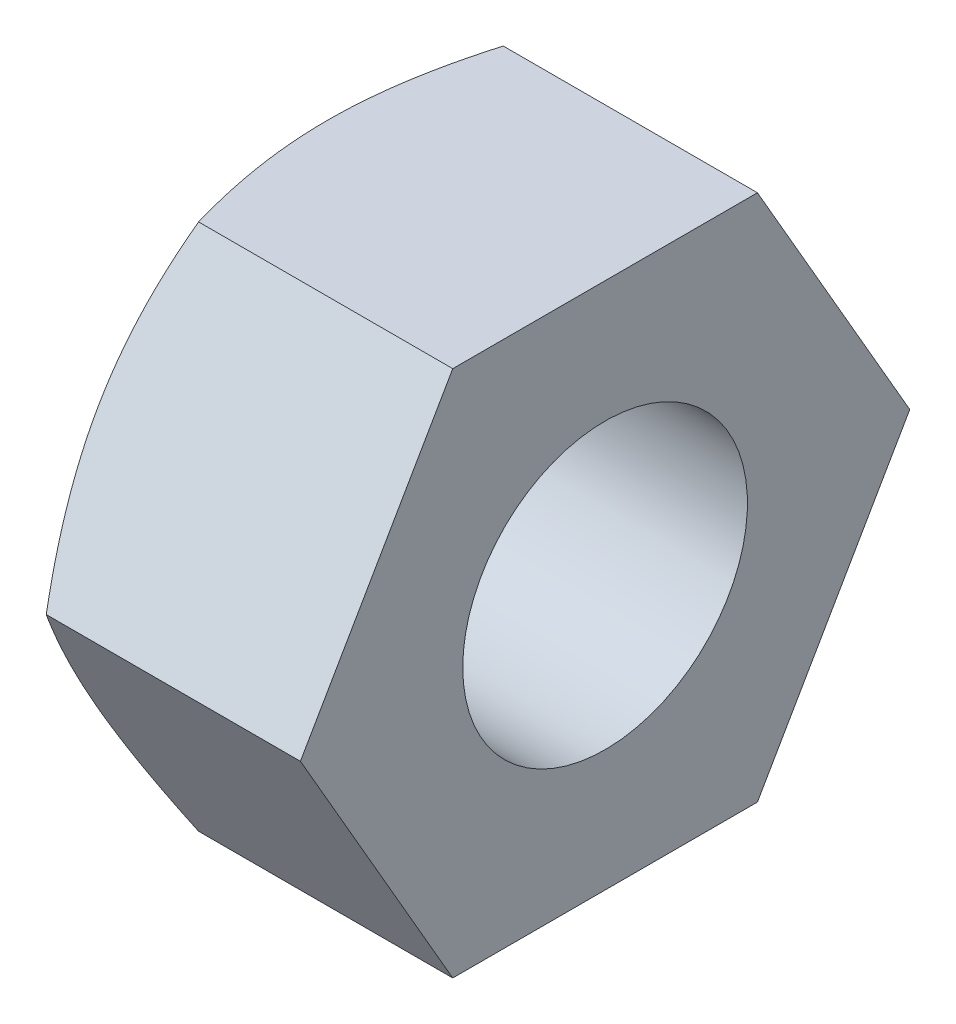
ISO-10303-21;
HEADER;
FILE_DESCRIPTION(('STEP AP214'),'2;1');
FILE_NAME('part.step','',(''),(''),'','','');
FILE_SCHEMA(('AUTOMOTIVE_DESIGN { 1 0 10303 214 1 1 1 1 }'));
ENDSEC;
DATA;
#1=APPLICATION_CONTEXT('core data for automotive mechanical design processes');
#2=APPLICATION_PROTOCOL_DEFINITION('international standard','automotive_design',2000,#1);
#3=PRODUCT_CONTEXT('',#1,'mechanical');
#4=PRODUCT('Part','Part','',(#3));
#5=PRODUCT_RELATED_PRODUCT_CATEGORY('part','',(#4));
#6=PRODUCT_DEFINITION_FORMATION('','',#4);
#7=PRODUCT_DEFINITION_CONTEXT('part definition',#1,'design');
#8=PRODUCT_DEFINITION('design','',#6,#7);
#9=PRODUCT_DEFINITION_SHAPE('','',#8);
#10=(LENGTH_UNIT() NAMED_UNIT(*) SI_UNIT(.MILLI.,.METRE.));
#11=(NAMED_UNIT(*) PLANE_ANGLE_UNIT() SI_UNIT($,.RADIAN.));
#12=(NAMED_UNIT(*) SI_UNIT($,.STERADIAN.) SOLID_ANGLE_UNIT());
#13=UNCERTAINTY_MEASURE_WITH_UNIT(LENGTH_MEASURE(1.E-05),#10,'distance_accuracy_value','');
#14=(GEOMETRIC_REPRESENTATION_CONTEXT(3) GLOBAL_UNCERTAINTY_ASSIGNED_CONTEXT((#13)) GLOBAL_UNIT_ASSIGNED_CONTEXT((#10,
#11,#12)) REPRESENTATION_CONTEXT('',''));
#15=CARTESIAN_POINT('',(0.,0.,0.));
#16=DIRECTION('',(0.,0.,1.));
#17=DIRECTION('',(1.,0.,0.));
#18=AXIS2_PLACEMENT_3D('',#15,#16,#17);
#19=CARTESIAN_POINT('',(484.152262189073,933.585270427388,20.));
#20=DIRECTION('',(-1.,0.,0.));
#21=DIRECTION('',(0.,0.,1.));
#22=AXIS2_PLACEMENT_3D('',#19,#20,#21);
#23=PLANE('',#22);
#24=DIRECTION('',(0.,0.,1.));
#25=VECTOR('',#24,1.);
#26=CARTESIAN_POINT('',(484.152262189073,924.085270427388,14.5151731));
#27=LINE('',#26,#25);
#28=CARTESIAN_POINT('',(484.152262189073,924.085270427388,14.5151731));
#29=VERTEX_POINT('',#28);
#30=CARTESIAN_POINT('',(484.152262189073,924.085270427388,25.4848269));
#31=VERTEX_POINT('',#30);
#32=EDGE_CURVE('E211',#29,#31,#27,.T.);
#33=ORIENTED_EDGE('',*,*,#32,.F.);
#34=DIRECTION('',(0.,-0.866025392230548,0.500000020011925));
#35=VECTOR('',#34,1.);
#36=CARTESIAN_POINT('',(484.152262189073,933.585270427388,9.03034525));
#37=LINE('',#36,#35);
#38=CARTESIAN_POINT('',(484.152262189073,933.585270427388,9.03034525));
#39=VERTEX_POINT('',#38);
#40=EDGE_CURVE('E203',#39,#29,#37,.T.);
#41=ORIENTED_EDGE('',*,*,#40,.F.);
#42=DIRECTION('',(0.,-0.866025392230549,-0.500000020011923));
#43=VECTOR('',#42,1.);
#44=CARTESIAN_POINT('',(484.152262189073,943.085270427388,14.5151731));
#45=LINE('',#44,#43);
#46=CARTESIAN_POINT('',(484.152262189073,943.085270427388,14.5151731));
#47=VERTEX_POINT('',#46);
#48=EDGE_CURVE('E52',#47,#39,#45,.T.);
#49=ORIENTED_EDGE('',*,*,#48,.F.);
#50=DIRECTION('',(0.,0.,-1.));
#51=VECTOR('',#50,1.);
#52=CARTESIAN_POINT('',(484.152262189073,943.085270427388,25.4848269));
#53=LINE('',#52,#51);
#54=CARTESIAN_POINT('',(484.152262189073,943.085270427388,25.4848269));
#55=VERTEX_POINT('',#54);
#56=EDGE_CURVE('E11',#55,#47,#53,.T.);
#57=ORIENTED_EDGE('',*,*,#56,.F.);
#58=DIRECTION('',(0.,0.866025392230547,-0.500000020011926));
#59=VECTOR('',#58,1.);
#60=CARTESIAN_POINT('',(484.152262189073,933.585270427388,30.96965475));
#61=LINE('',#60,#59);
#62=CARTESIAN_POINT('',(484.152262189073,933.585270427388,30.96965475));
#63=VERTEX_POINT('',#62);
#64=EDGE_CURVE('E173',#63,#55,#61,.T.);
#65=ORIENTED_EDGE('',*,*,#64,.F.);
#66=DIRECTION('',(0.,0.866025392230549,0.500000020011924));
#67=VECTOR('',#66,1.);
#68=CARTESIAN_POINT('',(484.152262189073,924.085270427388,25.4848269));
#69=LINE('',#68,#67);
#70=EDGE_CURVE('E46',#31,#63,#69,.T.);
#71=ORIENTED_EDGE('',*,*,#70,.F.);
#72=EDGE_LOOP('',(#33,#41,#49,#57,#65,#71));
#73=FACE_BOUND('',#72,.T.);
#74=CARTESIAN_POINT('',(484.152262189073,933.585270427388,20.));
#75=DIRECTION('',(1.,0.,0.));
#76=DIRECTION('',(0.,0.,-1.));
#77=AXIS2_PLACEMENT_3D('',#74,#75,#76);
#78=CIRCLE('',#77,5.125);
#79=CARTESIAN_POINT('',(484.152262189073,933.585270427388,25.125));
#80=VERTEX_POINT('',#79);
#81=EDGE_CURVE('E204',#80,#80,#78,.T.);
#82=ORIENTED_EDGE('',*,*,#81,.F.);
#83=EDGE_LOOP('',(#82));
#84=FACE_BOUND('',#83,.T.);
#85=ADVANCED_FACE('F42',(#73,#84),#23,.F.);
#86=CARTESIAN_POINT('',(474.152262189073,933.585270427388,20.));
#87=DIRECTION('',(-1.,0.,0.));
#88=DIRECTION('',(0.,0.,1.));
#89=AXIS2_PLACEMENT_3D('',#86,#87,#88);
#90=PLANE('',#89);
#91=CARTESIAN_POINT('',(474.152262189073,933.585270427388,20.));
#92=DIRECTION('',(1.,0.,0.));
#93=DIRECTION('',(0.,0.,-1.));
#94=AXIS2_PLACEMENT_3D('',#91,#92,#93);
#95=CIRCLE('',#94,5.125);
#96=CARTESIAN_POINT('',(474.152262189073,933.585270427388,25.125));
#97=VERTEX_POINT('',#96);
#98=EDGE_CURVE('E207',#97,#97,#95,.T.);
#99=ORIENTED_EDGE('',*,*,#98,.T.);
#100=EDGE_LOOP('',(#99));
#101=FACE_BOUND('',#100,.T.);
#102=CARTESIAN_POINT('',(474.152262189073,933.585270427388,20.));
#103=DIRECTION('',(-1.,0.,0.));
#104=DIRECTION('',(0.,1.,0.));
#105=AXIS2_PLACEMENT_3D('',#102,#103,#104);
#106=CIRCLE('',#105,9.5);
#107=CARTESIAN_POINT('',(474.152262189073,928.835270458523,11.7727591570239));
#108=VERTEX_POINT('',#107);
#109=CARTESIAN_POINT('',(474.152262189073,924.085270427388,20.));
#110=VERTEX_POINT('',#109);
#111=EDGE_CURVE('E167',#108,#110,#106,.T.);
#112=ORIENTED_EDGE('',*,*,#111,.T.);
#113=CARTESIAN_POINT('',(474.152262189073,933.585270427388,20.));
#114=DIRECTION('',(-1.,0.,0.));
#115=DIRECTION('',(0.,1.,0.));
#116=AXIS2_PLACEMENT_3D('',#113,#114,#115);
#117=CIRCLE('',#116,9.5);
#118=CARTESIAN_POINT('',(474.152262189073,928.835270458523,28.2272408429761));
#119=VERTEX_POINT('',#118);
#120=EDGE_CURVE('E85',#110,#119,#117,.T.);
#121=ORIENTED_EDGE('',*,*,#120,.T.);
#122=CARTESIAN_POINT('',(474.152262189073,933.585270427388,20.));
#123=DIRECTION('',(-1.,0.,0.));
#124=DIRECTION('',(0.,1.,0.));
#125=AXIS2_PLACEMENT_3D('',#122,#123,#124);
#126=CIRCLE('',#125,9.5);
#127=CARTESIAN_POINT('',(474.152262189073,938.335270396252,28.2272408429761));
#128=VERTEX_POINT('',#127);
#129=EDGE_CURVE('E221',#119,#128,#126,.T.);
#130=ORIENTED_EDGE('',*,*,#129,.T.);
#131=CARTESIAN_POINT('',(474.152262189073,933.585270427388,20.));
#132=DIRECTION('',(-1.,0.,0.));
#133=DIRECTION('',(0.,1.,0.));
#134=AXIS2_PLACEMENT_3D('',#131,#132,#133);
#135=CIRCLE('',#134,9.5);
#136=CARTESIAN_POINT('',(474.152262189073,943.085270427388,20.));
#137=VERTEX_POINT('',#136);
#138=EDGE_CURVE('E134',#128,#137,#135,.T.);
#139=ORIENTED_EDGE('',*,*,#138,.T.);
#140=CARTESIAN_POINT('',(474.152262189073,933.585270427388,20.));
#141=DIRECTION('',(-1.,0.,0.));
#142=DIRECTION('',(0.,1.,0.));
#143=AXIS2_PLACEMENT_3D('',#140,#141,#142);
#144=CIRCLE('',#143,9.5);
#145=CARTESIAN_POINT('',(474.152262189073,938.335270396252,11.7727591570239));
#146=VERTEX_POINT('',#145);
#147=EDGE_CURVE('E127',#137,#146,#144,.T.);
#148=ORIENTED_EDGE('',*,*,#147,.T.);
#149=CARTESIAN_POINT('',(474.152262189073,933.585270427388,20.));
#150=DIRECTION('',(-1.,0.,0.));
#151=DIRECTION('',(0.,1.,0.));
#152=AXIS2_PLACEMENT_3D('',#149,#150,#151);
#153=CIRCLE('',#152,9.5);
#154=EDGE_CURVE('E131',#146,#108,#153,.T.);
#155=ORIENTED_EDGE('',*,*,#154,.T.);
#156=EDGE_LOOP('',(#112,#121,#130,#139,#148,#155));
#157=FACE_BOUND('',#156,.T.);
#158=ADVANCED_FACE('F129',(#101,#157),#90,.T.);
#159=CARTESIAN_POINT('',(484.152262189073,943.085270427388,25.4848269));
#160=DIRECTION('',(0.,1.,0.));
#161=DIRECTION('',(0.,0.,-1.));
#162=AXIS2_PLACEMENT_3D('',#159,#160,#161);
#163=PLANE('',#162);
#164=CARTESIAN_POINT('',(474.152262189073,943.085270427388,20.));
#165=CARTESIAN_POINT('',(474.152262189086,943.085270427389,22.545517063937));
#166=CARTESIAN_POINT('',(475.000767775358,943.085270427388,25.4848269));
#167=(BOUNDED_CURVE() B_SPLINE_CURVE(2,(#164,#165,#166),.UNSPECIFIED.,.F.,
.F.) B_SPLINE_CURVE_WITH_KNOTS((3,3),(10.7974456791513,17.0732433713035),
.UNSPECIFIED.) CURVE() GEOMETRIC_REPRESENTATION_ITEM() RATIONAL_B_SPLINE_CURVE((1.,
1.06644520267348,1.055650535477)) REPRESENTATION_ITEM(''));
#168=CARTESIAN_POINT('',(475.000767775358,943.085270427388,25.4848269));
#169=VERTEX_POINT('',#168);
#170=EDGE_CURVE('E139',#137,#169,#167,.T.);
#171=ORIENTED_EDGE('',*,*,#170,.T.);
#172=DIRECTION('',(-1.,0.,0.));
#173=VECTOR('',#172,1.);
#174=CARTESIAN_POINT('',(484.152262189073,943.085270427388,25.4848269));
#175=LINE('',#174,#173);
#176=EDGE_CURVE('E175',#55,#169,#175,.T.);
#177=ORIENTED_EDGE('',*,*,#176,.F.);
#178=ORIENTED_EDGE('',*,*,#56,.T.);
#179=DIRECTION('',(-1.,0.,0.));
#180=VECTOR('',#179,1.);
#181=CARTESIAN_POINT('',(484.152262189073,943.085270427388,14.5151731));
#182=LINE('',#181,#180);
#183=CARTESIAN_POINT('',(475.000767775358,943.085270427388,14.5151731));
#184=VERTEX_POINT('',#183);
#185=EDGE_CURVE('E205',#47,#184,#182,.T.);
#186=ORIENTED_EDGE('',*,*,#185,.T.);
#187=CARTESIAN_POINT('',(475.000767775359,943.085270427388,14.5151731));
#188=CARTESIAN_POINT('',(474.15226218906,943.085270427387,17.4544829361147));
#189=CARTESIAN_POINT('',(474.152262189073,943.085270427388,20.));
#190=(BOUNDED_CURVE() B_SPLINE_CURVE(2,(#187,#188,#189),.UNSPECIFIED.,.F.,
.F.) B_SPLINE_CURVE_WITH_KNOTS((3,3),(4.5216479869088,10.7974456791513),
.UNSPECIFIED.) CURVE() GEOMETRIC_REPRESENTATION_ITEM() RATIONAL_B_SPLINE_CURVE((1.05565053547651,
1.06644520267422,1.)) REPRESENTATION_ITEM(''));
#191=EDGE_CURVE('E144',#184,#137,#190,.T.);
#192=ORIENTED_EDGE('',*,*,#191,.T.);
#193=EDGE_LOOP('',(#171,#177,#178,#186,#192));
#194=FACE_BOUND('',#193,.T.);
#195=ADVANCED_FACE('F281',(#194),#163,.T.);
#196=CARTESIAN_POINT('',(484.152262189073,943.085270427388,14.5151731));
#197=DIRECTION('',(0.,0.500000020011923,-0.866025392230549));
#198=DIRECTION('',(0.,-0.866025392230549,-0.500000020011923));
#199=AXIS2_PLACEMENT_3D('',#196,#197,#198);
#200=PLANE('',#199);
#201=CARTESIAN_POINT('',(474.152261933597,938.335270396252,11.7727591570239));
#202=CARTESIAN_POINT('',(474.152261933609,940.539753062995,13.0455178860133));
#203=CARTESIAN_POINT('',(475.000767775358,943.085270427388,14.5151731));
#204=(BOUNDED_CURVE() B_SPLINE_CURVE(2,(#201,#202,#203),.UNSPECIFIED.,.F.,
.F.) B_SPLINE_CURVE_WITH_KNOTS((3,3),(10.7974461394426,17.0732447572691),
.UNSPECIFIED.) CURVE() GEOMETRIC_REPRESENTATION_ITEM() RATIONAL_B_SPLINE_CURVE((1.,
1.06644521865146,1.0556505407591)) REPRESENTATION_ITEM(''));
#205=EDGE_CURVE('E140',#146,#184,#204,.T.);
#206=ORIENTED_EDGE('',*,*,#205,.T.);
#207=ORIENTED_EDGE('',*,*,#185,.F.);
#208=ORIENTED_EDGE('',*,*,#48,.T.);
#209=DIRECTION('',(-1.,0.,0.));
#210=VECTOR('',#209,1.);
#211=CARTESIAN_POINT('',(484.152262189073,933.585270427388,9.03034525));
#212=LINE('',#211,#210);
#213=CARTESIAN_POINT('',(475.000767754601,933.585270427388,9.03034525));
#214=VERTEX_POINT('',#213);
#215=EDGE_CURVE('E156',#39,#214,#212,.T.);
#216=ORIENTED_EDGE('',*,*,#215,.T.);
#217=CARTESIAN_POINT('',(475.000767754602,933.585270427389,9.03034525000001));
#218=CARTESIAN_POINT('',(474.152261933585,936.130787754581,10.5000004425101));
#219=CARTESIAN_POINT('',(474.152261933597,938.335270396252,11.7727591570239));
#220=(BOUNDED_CURVE() B_SPLINE_CURVE(2,(#217,#218,#219),.UNSPECIFIED.,.F.,
.F.) B_SPLINE_CURVE_WITH_KNOTS((3,3),(4.52164759751114,10.7974461394426),
.UNSPECIFIED.) CURVE() GEOMETRIC_REPRESENTATION_ITEM() RATIONAL_B_SPLINE_CURVE((1.05565054102018,
1.06644521784791,1.)) REPRESENTATION_ITEM(''));
#221=EDGE_CURVE('E152',#214,#146,#220,.T.);
#222=ORIENTED_EDGE('',*,*,#221,.T.);
#223=EDGE_LOOP('',(#206,#207,#208,#216,#222));
#224=FACE_BOUND('',#223,.T.);
#225=ADVANCED_FACE('F44',(#224),#200,.T.);
#226=CARTESIAN_POINT('',(484.152262189073,933.585270427388,9.03034525));
#227=DIRECTION('',(0.,-0.500000020011925,-0.866025392230548));
#228=DIRECTION('',(0.,-0.866025392230548,0.500000020011925));
#229=AXIS2_PLACEMENT_3D('',#226,#227,#228);
#230=PLANE('',#229);
#231=CARTESIAN_POINT('',(474.152261933597,928.835270458523,11.7727591570239));
#232=CARTESIAN_POINT('',(474.152261933609,931.039753100238,10.5000004424845));
#233=CARTESIAN_POINT('',(475.000767754601,933.585270427389,9.03034525));
#234=(BOUNDED_CURVE() B_SPLINE_CURVE(2,(#231,#232,#233),.UNSPECIFIED.,.F.,
.F.) B_SPLINE_CURVE_WITH_KNOTS((3,3),(10.7974461394426,17.0732446812836),
.UNSPECIFIED.) CURVE() GEOMETRIC_REPRESENTATION_ITEM() RATIONAL_B_SPLINE_CURVE((1.,
1.06644521784696,1.05565054102049)) REPRESENTATION_ITEM(''));
#235=EDGE_CURVE('E153',#108,#214,#234,.T.);
#236=ORIENTED_EDGE('',*,*,#235,.T.);
#237=ORIENTED_EDGE('',*,*,#215,.F.);
#238=ORIENTED_EDGE('',*,*,#40,.T.);
#239=DIRECTION('',(-1.,0.,0.));
#240=VECTOR('',#239,1.);
#241=CARTESIAN_POINT('',(484.152262189073,924.085270427388,14.5151731));
#242=LINE('',#241,#240);
#243=CARTESIAN_POINT('',(475.000767775358,924.085270427388,14.5151731));
#244=VERTEX_POINT('',#243);
#245=EDGE_CURVE('E250',#29,#244,#242,.T.);
#246=ORIENTED_EDGE('',*,*,#245,.T.);
#247=CARTESIAN_POINT('',(475.000767775358,924.085270427389,14.5151731));
#248=CARTESIAN_POINT('',(474.152261933585,926.630787791824,13.0455178859878));
#249=CARTESIAN_POINT('',(474.152261933597,928.835270458523,11.7727591570239));
#250=(BOUNDED_CURVE() B_SPLINE_CURVE(2,(#247,#248,#249),.UNSPECIFIED.,.F.,
.F.) B_SPLINE_CURVE_WITH_KNOTS((3,3),(4.52164752152574,10.7974461394426),
.UNSPECIFIED.) CURVE() GEOMETRIC_REPRESENTATION_ITEM() RATIONAL_B_SPLINE_CURVE((1.05565054075879,
1.06644521865242,1.)) REPRESENTATION_ITEM(''));
#251=EDGE_CURVE('E122',#244,#108,#250,.T.);
#252=ORIENTED_EDGE('',*,*,#251,.T.);
#253=EDGE_LOOP('',(#236,#237,#238,#246,#252));
#254=FACE_BOUND('',#253,.T.);
#255=ADVANCED_FACE('F287',(#254),#230,.T.);
#256=CARTESIAN_POINT('',(484.152262189073,933.585270427388,20.));
#257=DIRECTION('',(1.,0.,0.));
#258=DIRECTION('',(0.,0.,-1.));
#259=AXIS2_PLACEMENT_3D('',#256,#257,#258);
#260=CYLINDRICAL_SURFACE('',#259,5.125);
#261=ORIENTED_EDGE('',*,*,#81,.T.);
#262=EDGE_LOOP('',(#261));
#263=FACE_BOUND('',#262,.T.);
#264=ORIENTED_EDGE('',*,*,#98,.F.);
#265=EDGE_LOOP('',(#264));
#266=FACE_BOUND('',#265,.T.);
#267=ADVANCED_FACE('F289',(#263,#266),#260,.F.);
#268=CARTESIAN_POINT('',(484.152262189073,924.085270427388,14.5151731));
#269=DIRECTION('',(0.,-1.,0.));
#270=DIRECTION('',(0.,0.,1.));
#271=AXIS2_PLACEMENT_3D('',#268,#269,#270);
#272=PLANE('',#271);
#273=CARTESIAN_POINT('',(475.000767775359,924.085270427389,25.4848269));
#274=CARTESIAN_POINT('',(474.152262189061,924.085270427388,22.5455170638855));
#275=CARTESIAN_POINT('',(474.152262189073,924.085270427388,20.));
#276=(BOUNDED_CURVE() B_SPLINE_CURVE(2,(#273,#274,#275),.UNSPECIFIED.,.F.,
.F.) B_SPLINE_CURVE_WITH_KNOTS((3,3),(4.52164798690888,10.7974456791513),
.UNSPECIFIED.) CURVE() GEOMETRIC_REPRESENTATION_ITEM() RATIONAL_B_SPLINE_CURVE((1.05565053547655,
1.06644520267427,1.)) REPRESENTATION_ITEM(''));
#277=CARTESIAN_POINT('',(475.000767775358,924.085270427388,25.4848269));
#278=VERTEX_POINT('',#277);
#279=EDGE_CURVE('E188',#278,#110,#276,.T.);
#280=ORIENTED_EDGE('',*,*,#279,.T.);
#281=CARTESIAN_POINT('',(474.152262189073,924.085270427388,20.));
#282=CARTESIAN_POINT('',(474.152262189086,924.085270427388,17.4544829360633));
#283=CARTESIAN_POINT('',(475.000767775358,924.085270427387,14.5151731));
#284=(BOUNDED_CURVE() B_SPLINE_CURVE(2,(#281,#282,#283),.UNSPECIFIED.,.F.,
.F.) B_SPLINE_CURVE_WITH_KNOTS((3,3),(10.7974456791513,17.0732433713033),
.UNSPECIFIED.) CURVE() GEOMETRIC_REPRESENTATION_ITEM() RATIONAL_B_SPLINE_CURVE((1.,
1.06644520267331,1.05565053547686)) REPRESENTATION_ITEM(''));
#285=EDGE_CURVE('E172',#110,#244,#284,.T.);
#286=ORIENTED_EDGE('',*,*,#285,.T.);
#287=ORIENTED_EDGE('',*,*,#245,.F.);
#288=ORIENTED_EDGE('',*,*,#32,.T.);
#289=DIRECTION('',(-1.,0.,0.));
#290=VECTOR('',#289,1.);
#291=CARTESIAN_POINT('',(484.152262189073,924.085270427388,25.4848269));
#292=LINE('',#291,#290);
#293=EDGE_CURVE('E75',#31,#278,#292,.T.);
#294=ORIENTED_EDGE('',*,*,#293,.T.);
#295=EDGE_LOOP('',(#280,#286,#287,#288,#294));
#296=FACE_BOUND('',#295,.T.);
#297=ADVANCED_FACE('F295',(#296),#272,.T.);
#298=CARTESIAN_POINT('',(484.152262189073,924.085270427388,25.4848269));
#299=DIRECTION('',(0.,-0.500000020011924,0.866025392230549));
#300=DIRECTION('',(0.,0.866025392230549,0.500000020011924));
#301=AXIS2_PLACEMENT_3D('',#298,#299,#300);
#302=PLANE('',#301);
#303=CARTESIAN_POINT('',(475.000767754601,933.585270427389,30.96965475));
#304=CARTESIAN_POINT('',(474.152261933585,931.039753100195,29.4999995574898));
#305=CARTESIAN_POINT('',(474.152261933597,928.835270458523,28.2272408429761));
#306=(BOUNDED_CURVE() B_SPLINE_CURVE(2,(#303,#304,#305),.UNSPECIFIED.,.F.,
.F.) B_SPLINE_CURVE_WITH_KNOTS((3,3),(4.52164759751133,10.7974461394426),
.UNSPECIFIED.) CURVE() GEOMETRIC_REPRESENTATION_ITEM() RATIONAL_B_SPLINE_CURVE((1.05565054102012,
1.06644521784784,1.)) REPRESENTATION_ITEM(''));
#307=CARTESIAN_POINT('',(475.000767754601,933.585270427388,30.96965475));
#308=VERTEX_POINT('',#307);
#309=EDGE_CURVE('E163',#308,#119,#306,.T.);
#310=ORIENTED_EDGE('',*,*,#309,.T.);
#311=CARTESIAN_POINT('',(474.152261933597,928.835270458523,28.2272408429761));
#312=CARTESIAN_POINT('',(474.15226193361,926.630787791779,26.9544821139867));
#313=CARTESIAN_POINT('',(475.000767775358,924.085270427388,25.4848269));
#314=(BOUNDED_CURVE() B_SPLINE_CURVE(2,(#311,#312,#313),.UNSPECIFIED.,.F.,
.F.) B_SPLINE_CURVE_WITH_KNOTS((3,3),(10.7974461394426,17.0732447572691),
.UNSPECIFIED.) CURVE() GEOMETRIC_REPRESENTATION_ITEM() RATIONAL_B_SPLINE_CURVE((1.,
1.06644521865144,1.05565054075908)) REPRESENTATION_ITEM(''));
#315=EDGE_CURVE('E189',#119,#278,#314,.T.);
#316=ORIENTED_EDGE('',*,*,#315,.T.);
#317=ORIENTED_EDGE('',*,*,#293,.F.);
#318=ORIENTED_EDGE('',*,*,#70,.T.);
#319=DIRECTION('',(-1.,0.,0.));
#320=VECTOR('',#319,1.);
#321=CARTESIAN_POINT('',(484.152262189073,933.585270427388,30.96965475));
#322=LINE('',#321,#320);
#323=EDGE_CURVE('E176',#63,#308,#322,.T.);
#324=ORIENTED_EDGE('',*,*,#323,.T.);
#325=EDGE_LOOP('',(#310,#316,#317,#318,#324));
#326=FACE_BOUND('',#325,.T.);
#327=ADVANCED_FACE('F272',(#326),#302,.T.);
#328=CARTESIAN_POINT('',(484.152262189073,933.585270427388,30.96965475));
#329=DIRECTION('',(0.,0.500000020011926,0.866025392230547));
#330=DIRECTION('',(0.,0.866025392230547,-0.500000020011926));
#331=AXIS2_PLACEMENT_3D('',#328,#329,#330);
#332=PLANE('',#331);
#333=CARTESIAN_POINT('',(475.000767775358,943.085270427389,25.4848269));
#334=CARTESIAN_POINT('',(474.152261933585,940.539753062953,26.9544821140122));
#335=CARTESIAN_POINT('',(474.152261933597,938.335270396252,28.2272408429761));
#336=(BOUNDED_CURVE() B_SPLINE_CURVE(2,(#333,#334,#335),.UNSPECIFIED.,.F.,
.F.) B_SPLINE_CURVE_WITH_KNOTS((3,3),(4.52164752152601,10.7974461394427),
.UNSPECIFIED.) CURVE() GEOMETRIC_REPRESENTATION_ITEM() RATIONAL_B_SPLINE_CURVE((1.05565054075874,
1.06644521865235,1.)) REPRESENTATION_ITEM(''));
#337=EDGE_CURVE('E178',#169,#128,#336,.T.);
#338=ORIENTED_EDGE('',*,*,#337,.T.);
#339=CARTESIAN_POINT('',(474.152261933597,938.335270396252,28.2272408429761));
#340=CARTESIAN_POINT('',(474.15226193361,936.130787754536,29.4999995575155));
#341=CARTESIAN_POINT('',(475.0007677546,933.585270427387,30.96965475));
#342=(BOUNDED_CURVE() B_SPLINE_CURVE(2,(#339,#340,#341),.UNSPECIFIED.,.F.,
.F.) B_SPLINE_CURVE_WITH_KNOTS((3,3),(10.7974461394427,17.0732446812838),
.UNSPECIFIED.) CURVE() GEOMETRIC_REPRESENTATION_ITEM() RATIONAL_B_SPLINE_CURVE((1.,
1.06644521784701,1.05565054102053)) REPRESENTATION_ITEM(''));
#343=EDGE_CURVE('E183',#128,#308,#342,.T.);
#344=ORIENTED_EDGE('',*,*,#343,.T.);
#345=ORIENTED_EDGE('',*,*,#323,.F.);
#346=ORIENTED_EDGE('',*,*,#64,.T.);
#347=ORIENTED_EDGE('',*,*,#176,.T.);
#348=EDGE_LOOP('',(#338,#344,#345,#346,#347));
#349=FACE_BOUND('',#348,.T.);
#350=ADVANCED_FACE('F278',(#349),#332,.T.);
#351=CARTESIAN_POINT('',(475.477973824447,933.585270427388,20.));
#352=DIRECTION('',(1.,0.,0.));
#353=DIRECTION('',(0.,1.,0.));
#354=AXIS2_PLACEMENT_3D('',#351,#352,#353);
#355=CONICAL_SURFACE('',#354,11.796199908653,1.0471975511966);
#356=ORIENTED_EDGE('',*,*,#285,.F.);
#357=ORIENTED_EDGE('',*,*,#111,.F.);
#358=ORIENTED_EDGE('',*,*,#251,.F.);
#359=EDGE_LOOP('',(#356,#357,#358));
#360=FACE_BOUND('',#359,.T.);
#361=ADVANCED_FACE('F308',(#360),#355,.T.);
#362=CARTESIAN_POINT('',(475.477973824447,933.585270427388,20.));
#363=DIRECTION('',(1.,0.,0.));
#364=DIRECTION('',(0.,1.,0.));
#365=AXIS2_PLACEMENT_3D('',#362,#363,#364);
#366=CONICAL_SURFACE('',#365,11.796199908653,1.0471975511966);
#367=ORIENTED_EDGE('',*,*,#315,.F.);
#368=ORIENTED_EDGE('',*,*,#120,.F.);
#369=ORIENTED_EDGE('',*,*,#279,.F.);
#370=EDGE_LOOP('',(#367,#368,#369));
#371=FACE_BOUND('',#370,.T.);
#372=ADVANCED_FACE('F310',(#371),#366,.T.);
#373=CARTESIAN_POINT('',(475.477973824447,933.585270427388,20.));
#374=DIRECTION('',(1.,0.,0.));
#375=DIRECTION('',(0.,1.,0.));
#376=AXIS2_PLACEMENT_3D('',#373,#374,#375);
#377=CONICAL_SURFACE('',#376,11.796199908653,1.0471975511966);
#378=ORIENTED_EDGE('',*,*,#343,.F.);
#379=ORIENTED_EDGE('',*,*,#129,.F.);
#380=ORIENTED_EDGE('',*,*,#309,.F.);
#381=EDGE_LOOP('',(#378,#379,#380));
#382=FACE_BOUND('',#381,.T.);
#383=ADVANCED_FACE('F275',(#382),#377,.T.);
#384=CARTESIAN_POINT('',(475.477973824447,933.585270427388,20.));
#385=DIRECTION('',(1.,0.,0.));
#386=DIRECTION('',(0.,1.,0.));
#387=AXIS2_PLACEMENT_3D('',#384,#385,#386);
#388=CONICAL_SURFACE('',#387,11.796199908653,1.0471975511966);
#389=ORIENTED_EDGE('',*,*,#170,.F.);
#390=ORIENTED_EDGE('',*,*,#138,.F.);
#391=ORIENTED_EDGE('',*,*,#337,.F.);
#392=EDGE_LOOP('',(#389,#390,#391));
#393=FACE_BOUND('',#392,.T.);
#394=ADVANCED_FACE('F280',(#393),#388,.T.);
#395=CARTESIAN_POINT('',(475.477973824447,933.585270427388,20.));
#396=DIRECTION('',(1.,0.,0.));
#397=DIRECTION('',(0.,1.,0.));
#398=AXIS2_PLACEMENT_3D('',#395,#396,#397);
#399=CONICAL_SURFACE('',#398,11.796199908653,1.0471975511966);
#400=ORIENTED_EDGE('',*,*,#191,.F.);
#401=ORIENTED_EDGE('',*,*,#205,.F.);
#402=ORIENTED_EDGE('',*,*,#147,.F.);
#403=EDGE_LOOP('',(#400,#401,#402));
#404=FACE_BOUND('',#403,.T.);
#405=ADVANCED_FACE('F143',(#404),#399,.T.);
#406=CARTESIAN_POINT('',(475.477973824447,933.585270427388,20.));
#407=DIRECTION('',(1.,0.,0.));
#408=DIRECTION('',(0.,1.,0.));
#409=AXIS2_PLACEMENT_3D('',#406,#407,#408);
#410=CONICAL_SURFACE('',#409,11.796199908653,1.0471975511966);
#411=ORIENTED_EDGE('',*,*,#221,.F.);
#412=ORIENTED_EDGE('',*,*,#235,.F.);
#413=ORIENTED_EDGE('',*,*,#154,.F.);
#414=EDGE_LOOP('',(#411,#412,#413));
#415=FACE_BOUND('',#414,.T.);
#416=ADVANCED_FACE('F151',(#415),#410,.T.);
#417=CLOSED_SHELL('',(#85,#158,#195,#225,#255,#267,#297,#327,#350,#361,#372,#383,#394,#405,#416));
#418=MANIFOLD_SOLID_BREP('B2',#417);
#419=ADVANCED_BREP_SHAPE_REPRESENTATION('',(#18,#418),#14);
#420=SHAPE_DEFINITION_REPRESENTATION(#9,#419);
ENDSEC;
END-ISO-10303-21;
